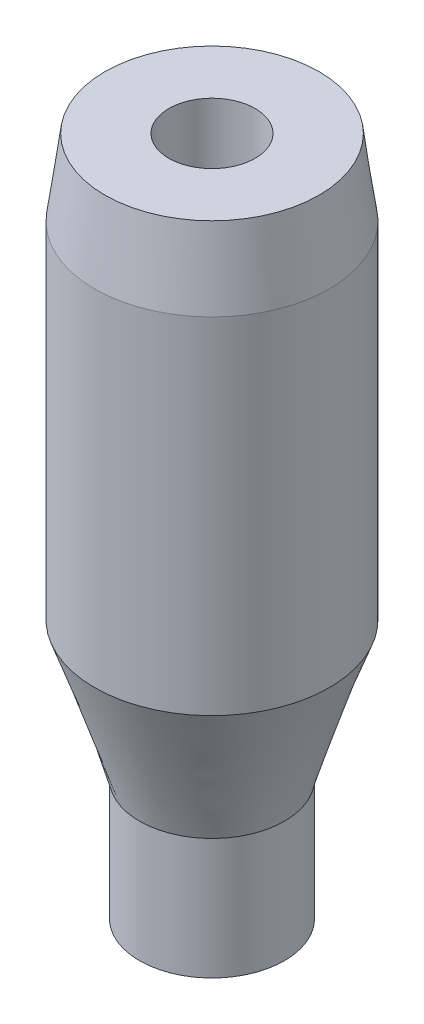
ISO-10303-21;
HEADER;
FILE_DESCRIPTION(('STEP AP214'),'2;1');
FILE_NAME('part.step','',(''),(''),'','','');
FILE_SCHEMA(('AUTOMOTIVE_DESIGN { 1 0 10303 214 1 1 1 1 }'));
ENDSEC;
DATA;
#1=APPLICATION_CONTEXT('core data for automotive mechanical design processes');
#2=APPLICATION_PROTOCOL_DEFINITION('international standard','automotive_design',2000,#1);
#3=PRODUCT_CONTEXT('',#1,'mechanical');
#4=PRODUCT('Part','Part','',(#3));
#5=PRODUCT_RELATED_PRODUCT_CATEGORY('part','',(#4));
#6=PRODUCT_DEFINITION_FORMATION('','',#4);
#7=PRODUCT_DEFINITION_CONTEXT('part definition',#1,'design');
#8=PRODUCT_DEFINITION('design','',#6,#7);
#9=PRODUCT_DEFINITION_SHAPE('','',#8);
#10=(LENGTH_UNIT() NAMED_UNIT(*) SI_UNIT(.MILLI.,.METRE.));
#11=(NAMED_UNIT(*) PLANE_ANGLE_UNIT() SI_UNIT($,.RADIAN.));
#12=(NAMED_UNIT(*) SI_UNIT($,.STERADIAN.) SOLID_ANGLE_UNIT());
#13=UNCERTAINTY_MEASURE_WITH_UNIT(LENGTH_MEASURE(1.E-05),#10,'distance_accuracy_value','');
#14=(GEOMETRIC_REPRESENTATION_CONTEXT(3) GLOBAL_UNCERTAINTY_ASSIGNED_CONTEXT((#13)) GLOBAL_UNIT_ASSIGNED_CONTEXT((#10,
#11,#12)) REPRESENTATION_CONTEXT('',''));
#15=CARTESIAN_POINT('',(0.,0.,0.));
#16=DIRECTION('',(0.,0.,1.));
#17=DIRECTION('',(1.,0.,0.));
#18=AXIS2_PLACEMENT_3D('',#15,#16,#17);
#19=CARTESIAN_POINT('',(0.,7.5,0.));
#20=DIRECTION('',(0.,-1.,0.));
#21=DIRECTION('',(0.,0.,-1.));
#22=AXIS2_PLACEMENT_3D('',#19,#20,#21);
#23=CYLINDRICAL_SURFACE('',#22,2.1);
#24=CARTESIAN_POINT('',(0.,0.,0.));
#25=DIRECTION('',(0.,1.,0.));
#26=DIRECTION('',(0.,0.,1.));
#27=AXIS2_PLACEMENT_3D('',#24,#25,#26);
#28=CIRCLE('',#27,2.1);
#29=CARTESIAN_POINT('',(0.,0.,2.1));
#30=VERTEX_POINT('',#29);
#31=EDGE_CURVE('E46',#30,#30,#28,.T.);
#32=ORIENTED_EDGE('',*,*,#31,.T.);
#33=EDGE_LOOP('',(#32));
#34=FACE_BOUND('',#33,.T.);
#35=CARTESIAN_POINT('',(-1.89448131467323,3.5,0.906057695930015));
#36=CARTESIAN_POINT('',(-0.082365922813197,3.5,4.69502032527647));
#37=CARTESIAN_POINT('',(3.70659670653326,3.5,2.88290493341644));
#38=CARTESIAN_POINT('',(1.89448131467323,3.5,-0.906057695930015));
#39=CARTESIAN_POINT('',(0.0823659228131966,3.5,-4.69502032527647));
#40=CARTESIAN_POINT('',(-3.70659670653326,3.5,-2.88290493341644));
#41=CARTESIAN_POINT('',(-1.89448131467323,3.5,0.906057695930015));
#42=(BOUNDED_CURVE() B_SPLINE_CURVE(3,(#35,#36,#37,#38,#39,#40,#41),.UNSPECIFIED.,.T.,
.F.) B_SPLINE_CURVE_WITH_KNOTS((4,3,4),(0.,0.5,1.),
.UNSPECIFIED.) CURVE() GEOMETRIC_REPRESENTATION_ITEM() RATIONAL_B_SPLINE_CURVE((1.,
0.333333333333333,0.333333333333333,1.,0.333333333333333,0.333333333333333,1.)) REPRESENTATION_ITEM(''));
#43=CARTESIAN_POINT('',(-1.89448131467323,3.5,0.906057695930015));
#44=VERTEX_POINT('',#43);
#45=EDGE_CURVE('E11',#44,#44,#42,.T.);
#46=ORIENTED_EDGE('',*,*,#45,.F.);
#47=EDGE_LOOP('',(#46));
#48=FACE_BOUND('',#47,.T.);
#49=ADVANCED_FACE('F38',(#34,#48),#23,.T.);
#50=CARTESIAN_POINT('',(0.,0.,0.));
#51=DIRECTION('',(0.,1.,0.));
#52=DIRECTION('',(0.,0.,1.));
#53=AXIS2_PLACEMENT_3D('',#50,#51,#52);
#54=PLANE('',#53);
#55=CARTESIAN_POINT('',(0.,0.,0.));
#56=DIRECTION('',(0.,1.,0.));
#57=DIRECTION('',(0.,0.,1.));
#58=AXIS2_PLACEMENT_3D('',#55,#56,#57);
#59=CIRCLE('',#58,1.25);
#60=CARTESIAN_POINT('',(0.,0.,1.25));
#61=VERTEX_POINT('',#60);
#62=EDGE_CURVE('E128',#61,#61,#59,.T.);
#63=ORIENTED_EDGE('',*,*,#62,.T.);
#64=EDGE_LOOP('',(#63));
#65=FACE_BOUND('',#64,.T.);
#66=ORIENTED_EDGE('',*,*,#31,.F.);
#67=EDGE_LOOP('',(#66));
#68=FACE_BOUND('',#67,.T.);
#69=ADVANCED_FACE('F98',(#65,#68),#54,.F.);
#70=CARTESIAN_POINT('',(-3.38813523365725,7.5,0.28379506417542));
#71=CARTESIAN_POINT('',(-1.89448131467323,3.5,0.906057695930015));
#72=CARTESIAN_POINT('',(-3.95572536200809,7.5,-6.49247540313908));
#73=CARTESIAN_POINT('',(-3.70659670653326,3.5,-2.88290493341644));
#74=CARTESIAN_POINT('',(2.82054510530641,7.5,-7.06006553148992));
#75=CARTESIAN_POINT('',(0.0823659228131957,3.5,-4.69502032527647));
#76=CARTESIAN_POINT('',(3.38813523365725,7.5,-0.28379506417542));
#77=CARTESIAN_POINT('',(1.89448131467323,3.5,-0.906057695930015));
#78=CARTESIAN_POINT('',(3.95572536200809,7.5,6.49247540313907));
#79=CARTESIAN_POINT('',(3.70659670653326,3.5,2.88290493341644));
#80=CARTESIAN_POINT('',(-2.82054510530641,7.5,7.06006553148991));
#81=CARTESIAN_POINT('',(-0.0823659228131961,3.5,4.69502032527647));
#82=CARTESIAN_POINT('',(-3.38813523365725,7.5,0.28379506417542));
#83=CARTESIAN_POINT('',(-1.89448131467323,3.5,0.906057695930015));
#84=(BOUNDED_SURFACE() B_SPLINE_SURFACE(3,1,((#70,#71),(#72,#73),(#74,#75),(#76,#77),(#78,#79),
(#80,#81),(#82,#83)),.UNSPECIFIED.,.T.,.F.,.F.) B_SPLINE_SURFACE_WITH_KNOTS((4,3,4),(2,2),(0.,
0.5,1.),(0.,1.),.UNSPECIFIED.) GEOMETRIC_REPRESENTATION_ITEM() RATIONAL_B_SPLINE_SURFACE(((1.,
1.),(0.333333333333333,0.333333333333333),(0.333333333333333,0.333333333333333),(1.,1.),
(0.333333333333334,0.333333333333333),(0.333333333333334,0.333333333333333),(1.,1.))) REPRESENTATION_ITEM('') SURFACE());
#85=CARTESIAN_POINT('',(0.,7.5,0.));
#86=DIRECTION('',(0.,1.,0.));
#87=DIRECTION('',(0.,0.,1.));
#88=AXIS2_PLACEMENT_3D('',#85,#86,#87);
#89=CIRCLE('',#88,3.4);
#90=CARTESIAN_POINT('',(0.,7.5,3.4));
#91=VERTEX_POINT('',#90);
#92=EDGE_CURVE('E51',#91,#91,#89,.T.);
#93=ORIENTED_EDGE('',*,*,#92,.F.);
#94=EDGE_LOOP('',(#93));
#95=FACE_BOUND('',#94,.T.);
#96=ORIENTED_EDGE('',*,*,#45,.T.);
#97=EDGE_LOOP('',(#96));
#98=FACE_BOUND('',#97,.T.);
#99=ADVANCED_FACE('F89',(#95,#98),#84,.T.);
#100=CARTESIAN_POINT('',(0.,17.5,0.));
#101=DIRECTION('',(0.,-1.,0.));
#102=DIRECTION('',(0.,0.,-1.));
#103=AXIS2_PLACEMENT_3D('',#100,#101,#102);
#104=CYLINDRICAL_SURFACE('',#103,3.4);
#105=CARTESIAN_POINT('',(0.,17.5,0.));
#106=DIRECTION('',(0.,-1.,0.));
#107=DIRECTION('',(0.,0.,-1.));
#108=AXIS2_PLACEMENT_3D('',#105,#106,#107);
#109=CIRCLE('',#108,3.4);
#110=CARTESIAN_POINT('',(0.,17.5,-3.4));
#111=VERTEX_POINT('',#110);
#112=EDGE_CURVE('E56',#111,#111,#109,.F.);
#113=ORIENTED_EDGE('',*,*,#112,.F.);
#114=EDGE_LOOP('',(#113));
#115=FACE_BOUND('',#114,.T.);
#116=ORIENTED_EDGE('',*,*,#92,.T.);
#117=EDGE_LOOP('',(#116));
#118=FACE_BOUND('',#117,.T.);
#119=ADVANCED_FACE('F78',(#115,#118),#104,.T.);
#120=CARTESIAN_POINT('',(0.,19.7,0.));
#121=DIRECTION('',(0.,1.,0.));
#122=DIRECTION('',(0.,0.,1.));
#123=AXIS2_PLACEMENT_3D('',#120,#121,#122);
#124=PLANE('',#123);
#125=CARTESIAN_POINT('',(0.,19.7,0.));
#126=DIRECTION('',(0.,1.,0.));
#127=DIRECTION('',(0.,0.,1.));
#128=AXIS2_PLACEMENT_3D('',#125,#126,#127);
#129=CIRCLE('',#128,1.25);
#130=CARTESIAN_POINT('',(0.,19.7,1.25));
#131=VERTEX_POINT('',#130);
#132=EDGE_CURVE('E160',#131,#131,#129,.T.);
#133=ORIENTED_EDGE('',*,*,#132,.F.);
#134=EDGE_LOOP('',(#133));
#135=FACE_BOUND('',#134,.T.);
#136=CARTESIAN_POINT('',(0.,19.7,0.));
#137=DIRECTION('',(0.,1.,0.));
#138=DIRECTION('',(0.,0.,1.));
#139=AXIS2_PLACEMENT_3D('',#136,#137,#138);
#140=CIRCLE('',#139,3.1);
#141=CARTESIAN_POINT('',(0.,19.7,3.1));
#142=VERTEX_POINT('',#141);
#143=EDGE_CURVE('E125',#142,#142,#140,.T.);
#144=ORIENTED_EDGE('',*,*,#143,.T.);
#145=EDGE_LOOP('',(#144));
#146=FACE_BOUND('',#145,.T.);
#147=ADVANCED_FACE('F88',(#135,#146),#124,.T.);
#148=CARTESIAN_POINT('',(0.,19.7,0.));
#149=DIRECTION('',(0.,-1.,0.));
#150=DIRECTION('',(0.,0.,-1.));
#151=AXIS2_PLACEMENT_3D('',#148,#149,#150);
#152=CONICAL_SURFACE('',#151,3.1,0.135527713985501);
#153=ORIENTED_EDGE('',*,*,#143,.F.);
#154=EDGE_LOOP('',(#153));
#155=FACE_BOUND('',#154,.T.);
#156=ORIENTED_EDGE('',*,*,#112,.T.);
#157=EDGE_LOOP('',(#156));
#158=FACE_BOUND('',#157,.T.);
#159=ADVANCED_FACE('F91',(#155,#158),#152,.T.);
#160=CARTESIAN_POINT('',(0.,0.,0.));
#161=DIRECTION('',(0.,1.,0.));
#162=DIRECTION('',(0.,0.,1.));
#163=AXIS2_PLACEMENT_3D('',#160,#161,#162);
#164=CYLINDRICAL_SURFACE('',#163,1.25);
#165=ORIENTED_EDGE('',*,*,#62,.F.);
#166=EDGE_LOOP('',(#165));
#167=FACE_BOUND('',#166,.T.);
#168=ORIENTED_EDGE('',*,*,#132,.T.);
#169=EDGE_LOOP('',(#168));
#170=FACE_BOUND('',#169,.T.);
#171=ADVANCED_FACE('F142',(#167,#170),#164,.F.);
#172=CLOSED_SHELL('',(#49,#69,#99,#119,#147,#159,#171));
#173=MANIFOLD_SOLID_BREP('B2',#172);
#174=ADVANCED_BREP_SHAPE_REPRESENTATION('',(#18,#173),#14);
#175=SHAPE_DEFINITION_REPRESENTATION(#9,#174);
ENDSEC;
END-ISO-10303-21;
